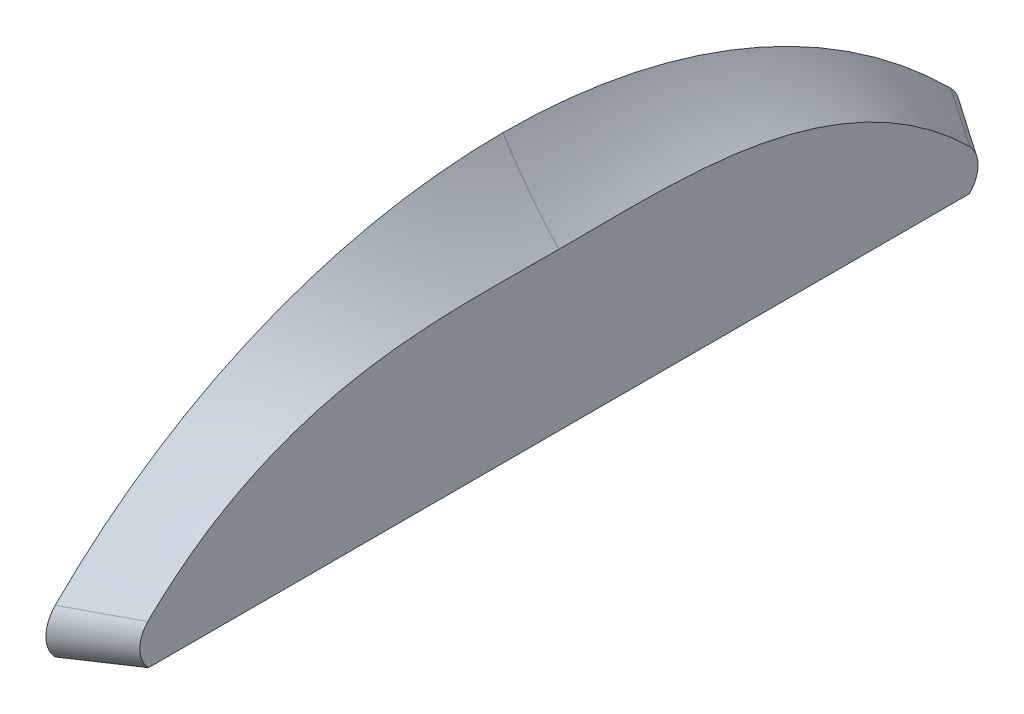
ISO-10303-21;
HEADER;
FILE_DESCRIPTION(('STEP AP214'),'2;1');
FILE_NAME('part.step','',(''),(''),'','','');
FILE_SCHEMA(('AUTOMOTIVE_DESIGN { 1 0 10303 214 1 1 1 1 }'));
ENDSEC;
DATA;
#1=APPLICATION_CONTEXT('core data for automotive mechanical design processes');
#2=APPLICATION_PROTOCOL_DEFINITION('international standard','automotive_design',2000,#1);
#3=PRODUCT_CONTEXT('',#1,'mechanical');
#4=PRODUCT('Part','Part','',(#3));
#5=PRODUCT_RELATED_PRODUCT_CATEGORY('part','',(#4));
#6=PRODUCT_DEFINITION_FORMATION('','',#4);
#7=PRODUCT_DEFINITION_CONTEXT('part definition',#1,'design');
#8=PRODUCT_DEFINITION('design','',#6,#7);
#9=PRODUCT_DEFINITION_SHAPE('','',#8);
#10=(LENGTH_UNIT() NAMED_UNIT(*) SI_UNIT(.MILLI.,.METRE.));
#11=(NAMED_UNIT(*) PLANE_ANGLE_UNIT() SI_UNIT($,.RADIAN.));
#12=(NAMED_UNIT(*) SI_UNIT($,.STERADIAN.) SOLID_ANGLE_UNIT());
#13=UNCERTAINTY_MEASURE_WITH_UNIT(LENGTH_MEASURE(1.E-05),#10,'distance_accuracy_value','');
#14=(GEOMETRIC_REPRESENTATION_CONTEXT(3) GLOBAL_UNCERTAINTY_ASSIGNED_CONTEXT((#13)) GLOBAL_UNIT_ASSIGNED_CONTEXT((#10,
#11,#12)) REPRESENTATION_CONTEXT('',''));
#15=CARTESIAN_POINT('',(0.,0.,0.));
#16=DIRECTION('',(0.,0.,1.));
#17=DIRECTION('',(1.,0.,0.));
#18=AXIS2_PLACEMENT_3D('',#15,#16,#17);
#19=CARTESIAN_POINT('',(0.,2.,-2.));
#20=DIRECTION('',(-1.,0.,0.));
#21=DIRECTION('',(0.,0.,1.));
#22=AXIS2_PLACEMENT_3D('',#19,#20,#21);
#23=PLANE('',#22);
#24=CARTESIAN_POINT('',(0.,4.99999999999999,-40.));
#25=DIRECTION('',(-1.,0.,0.));
#26=DIRECTION('',(0.,0.,1.));
#27=AXIS2_PLACEMENT_3D('',#24,#25,#26);
#28=CIRCLE('',#27,4.);
#29=CARTESIAN_POINT('',(0.,4.99999999999999,-36.));
#30=VERTEX_POINT('',#29);
#31=EDGE_CURVE('E217',#30,#30,#28,.T.);
#32=ORIENTED_EDGE('',*,*,#31,.F.);
#33=EDGE_LOOP('',(#32));
#34=FACE_BOUND('',#33,.T.);
#35=CARTESIAN_POINT('',(0.,2.,-2.));
#36=DIRECTION('',(1.,0.,0.));
#37=DIRECTION('',(0.,0.,1.));
#38=AXIS2_PLACEMENT_3D('',#35,#36,#37);
#39=CIRCLE('',#38,2.82842712474619);
#40=CARTESIAN_POINT('',(0.,4.,0.));
#41=VERTEX_POINT('',#40);
#42=CARTESIAN_POINT('',(0.,0.,0.));
#43=VERTEX_POINT('',#42);
#44=EDGE_CURVE('E345',#41,#43,#39,.T.);
#45=ORIENTED_EDGE('',*,*,#44,.F.);
#46=CARTESIAN_POINT('',(0.,-36.0000000000002,-40.));
#47=DIRECTION('',(1.,0.,0.));
#48=DIRECTION('',(0.,0.,1.));
#49=AXIS2_PLACEMENT_3D('',#46,#47,#48);
#50=CIRCLE('',#49,56.5685424949239);
#51=CARTESIAN_POINT('',(0.,20.5685424949238,-40.));
#52=VERTEX_POINT('',#51);
#53=EDGE_CURVE('E199',#52,#41,#50,.T.);
#54=ORIENTED_EDGE('',*,*,#53,.F.);
#55=CARTESIAN_POINT('',(0.,3.99999999999999,-80.));
#56=VERTEX_POINT('',#55);
#57=EDGE_CURVE('E344',#56,#52,#50,.T.);
#58=ORIENTED_EDGE('',*,*,#57,.F.);
#59=CARTESIAN_POINT('',(0.,2.,-78.));
#60=DIRECTION('',(1.,0.,0.));
#61=DIRECTION('',(0.,0.,-1.));
#62=AXIS2_PLACEMENT_3D('',#59,#60,#61);
#63=CIRCLE('',#62,2.8284271247462);
#64=CARTESIAN_POINT('',(0.,0.,-80.));
#65=VERTEX_POINT('',#64);
#66=EDGE_CURVE('E300',#65,#56,#63,.T.);
#67=ORIENTED_EDGE('',*,*,#66,.F.);
#68=DIRECTION('',(0.,0.,-1.));
#69=VECTOR('',#68,1.);
#70=CARTESIAN_POINT('',(0.,0.,0.));
#71=LINE('',#70,#69);
#72=EDGE_CURVE('E205',#43,#65,#71,.T.);
#73=ORIENTED_EDGE('',*,*,#72,.F.);
#74=EDGE_LOOP('',(#45,#54,#58,#67,#73));
#75=FACE_BOUND('',#74,.T.);
#76=ADVANCED_FACE('F140',(#34,#75),#23,.T.);
#77=CARTESIAN_POINT('',(0.,3.99999999999999,-80.));
#78=CARTESIAN_POINT('',(16.6666666666667,2.66666666666666,-69.0847300683473));
#79=CARTESIAN_POINT('',(33.3333333333333,1.33333333333333,-58.1694601366945));
#80=CARTESIAN_POINT('',(50.,0.,-47.2541902050417));
#81=CARTESIAN_POINT('',(0.,6.63904405261519,-77.3609559473848));
#82=CARTESIAN_POINT('',(16.6666666666667,4.57394141092913,-67.1632839463743));
#83=CARTESIAN_POINT('',(33.3333333333333,2.50883876924307,-56.9656119453637));
#84=CARTESIAN_POINT('',(50.,0.443736127557011,-46.7679399443531));
#85=CARTESIAN_POINT('',(0.,11.3720944633804,-71.5812116978277));
#86=CARTESIAN_POINT('',(15.950170355026,6.51788597364558,-62.9574696470849));
#87=CARTESIAN_POINT('',(32.629103556807,3.88093649349558,-54.3337275963421));
#88=CARTESIAN_POINT('',(50.,1.245103807066,-45.7099855455994));
#89=CARTESIAN_POINT('',(0.,16.6162347407487,-61.7420127961851));
#90=CARTESIAN_POINT('',(13.8006814201041,5.87642750944805,-55.8014690698099));
#91=CARTESIAN_POINT('',(30.5164142272278,4.00565631648663,-49.8609253434348));
#92=CARTESIAN_POINT('',(50.,2.13935229840692,-43.9203816170601));
#93=CARTESIAN_POINT('',(0.,19.8401866065488,-51.0920119199332));
#94=CARTESIAN_POINT('',(11.6511924851822,3.7734502946322,-48.058931934915));
#95=CARTESIAN_POINT('',(28.4037248976486,3.22752704980928,-45.0258519498969));
#96=CARTESIAN_POINT('',(50.,2.68942136102937,-41.9927719648795));
#97=CARTESIAN_POINT('',(0.,20.5685424949238,-43.7023061077576));
#98=CARTESIAN_POINT('',(10.9346961735416,2.8215150380922,-42.6893373185495));
#99=CARTESIAN_POINT('',(27.6994951211223,2.81257236123952,-41.6763685293058));
#100=CARTESIAN_POINT('',(50.,2.8125767374507,-40.6633997403421));
#101=CARTESIAN_POINT('',(0.,20.5685424949238,-40.));
#102=CARTESIAN_POINT('',(10.9346961735416,2.82153606086535,-40.));
#103=CARTESIAN_POINT('',(27.6994951211223,2.81260170348539,-40.));
#104=CARTESIAN_POINT('',(50.,2.81260169586887,-40.0000000000008));
#105=B_SPLINE_SURFACE_WITH_KNOTS('',3,3,((#77,#78,#79,#80),(#81,#82,#83,#84),(#85,#86,#87,#88),
(#89,#90,#91,#92),(#93,#94,#95,#96),(#97,#98,#99,#100),(#101,#102,#103,#104)),.UNSPECIFIED.,.F.,
.F.,.F.,(4,1,1,1,4),(4,4),(0.744223091094177,0.808167318320632,0.872111545547088,
0.936055772773544,1.),(0.,1.),.UNSPECIFIED.);
#106=CARTESIAN_POINT('',(5.,3.59999999999999,-76.7254190205042));
#107=CARTESIAN_POINT('',(5.,3.93743228357616,-76.3874018561561));
#108=CARTESIAN_POINT('',(5.,4.26765023761743,-76.0421847193579));
#109=CARTESIAN_POINT('',(5.,4.91305336804679,-75.3380492013204));
#110=CARTESIAN_POINT('',(5.,5.22824034681512,-74.9791324721533));
#111=CARTESIAN_POINT('',(5.,5.84303741353757,-74.2482403196132));
#112=CARTESIAN_POINT('',(5.,6.14264858405348,-73.8762658068108));
#113=CARTESIAN_POINT('',(5.,6.7257829860108,-73.1199272854748));
#114=CARTESIAN_POINT('',(5.,7.00930660717979,-72.7355635774285));
#115=CARTESIAN_POINT('',(5.,7.55501458514436,-71.9619058359314));
#116=CARTESIAN_POINT('',(5.,7.81748343604167,-71.5728124190995));
#117=CARTESIAN_POINT('',(5.,8.32599247402661,-70.7840431241096));
#118=CARTESIAN_POINT('',(5.,8.57203291478204,-70.384367409484));
#119=CARTESIAN_POINT('',(5.,9.0473155388448,-69.575165888886));
#120=CARTESIAN_POINT('',(5.,9.27655818285029,-69.1656403534653));
#121=CARTESIAN_POINT('',(5.,9.7179358459217,-68.3375077942191));
#122=CARTESIAN_POINT('',(5.,9.93007196262451,-67.9189013552585));
#123=CARTESIAN_POINT('',(5.,10.3373422104496,-67.0728350064427));
#124=CARTESIAN_POINT('',(5.,10.5324540206845,-66.6453643565745));
#125=CARTESIAN_POINT('',(5.,10.9052984125998,-65.7829008197929));
#126=CARTESIAN_POINT('',(5.,11.0830305296047,-65.3479077321202));
#127=CARTESIAN_POINT('',(5.,11.4211557563464,-64.4712051567223));
#128=CARTESIAN_POINT('',(5.,11.5815476779937,-64.0294952111435));
#129=CARTESIAN_POINT('',(5.,11.8851368938041,-63.1402056710114));
#130=CARTESIAN_POINT('',(5.,12.0283339677281,-62.6926260013574));
#131=CARTESIAN_POINT('',(5.,12.2990221749549,-61.7883957563251));
#132=CARTESIAN_POINT('',(5.,12.4263617772562,-61.331699878374));
#133=CARTESIAN_POINT('',(5.,12.6642653606371,-60.4139905299096));
#134=CARTESIAN_POINT('',(5.,12.7748300989486,-59.9529772552854));
#135=CARTESIAN_POINT('',(5.,12.979772806041,-59.027431837586));
#136=CARTESIAN_POINT('',(5.,13.0741526428364,-58.5629001070715));
#137=CARTESIAN_POINT('',(5.,13.2475078904096,-57.6311638525804));
#138=CARTESIAN_POINT('',(5.,13.3264890258607,-57.1639603886011));
#139=CARTESIAN_POINT('',(5.,13.4834911977533,-56.1395599554604));
#140=CARTESIAN_POINT('',(5.,13.5585569415281,-55.5819104072356));
#141=CARTESIAN_POINT('',(5.,13.6902095100587,-54.4644382967973));
#142=CARTESIAN_POINT('',(5.,13.7467955399675,-53.9046156421621));
#143=CARTESIAN_POINT('',(5.,13.8436291600977,-52.7832396184939));
#144=CARTESIAN_POINT('',(5.,13.8838668706888,-52.2216854089481));
#145=CARTESIAN_POINT('',(5.,13.9503294054591,-51.0973089222936));
#146=CARTESIAN_POINT('',(5.,13.9765427549874,-50.5344859840233));
#147=CARTESIAN_POINT('',(5.,14.017455103225,-49.4080448908364));
#148=CARTESIAN_POINT('',(5.,14.0321460205014,-48.8444264550463));
#149=CARTESIAN_POINT('',(5.,14.052549816619,-47.7275563872463));
#150=CARTESIAN_POINT('',(5.,14.0584250202647,-47.1743074462124));
#151=CARTESIAN_POINT('',(5.,14.0643881773846,-46.0679660488893));
#152=CARTESIAN_POINT('',(5.,14.0644779979006,-45.514873599719));
#153=CARTESIAN_POINT('',(5.,14.0615319358146,-44.4092862800449));
#154=CARTESIAN_POINT('',(5.,14.0584993546539,-43.856791395417));
#155=CARTESIAN_POINT('',(5.,14.0518660343467,-42.7528399211496));
#156=CARTESIAN_POINT('',(5.,14.048266369452,-42.2013833240343));
#157=CARTESIAN_POINT('',(5.,14.0441755921167,-41.3749374732235));
#158=CARTESIAN_POINT('',(5.,14.0430307910705,-41.0999519509151));
#159=CARTESIAN_POINT('',(5.,14.0414238818554,-40.549977837875));
#160=CARTESIAN_POINT('',(5.00000000000001,14.0409617766091,-40.2749892471352));
#161=CARTESIAN_POINT('',(5.00000000000003,14.0409660441617,-40.));
#162=B_SPLINE_CURVE_WITH_KNOTS('',3,(#106,#107,#108,#109,#110,#111,#112,#113,#114,#115,#116,
#117,#118,#119,#120,#121,#122,#123,#124,#125,#126,#127,#128,#129,#130,#131,#132,#133,#134,#135,
#136,#137,#138,#139,#140,#141,#142,#143,#144,#145,#146,#147,#148,#149,#150,#151,#152,#153,#154,
#155,#156,#157,#158,#159,#160,#161),.UNSPECIFIED.,.F.,.F.,(4,2,2,2,2,2,2,2,2,2,2,2,2,2,2,2,2,2,
2,2,2,2,2,2,2,2,2,4),(0.,1.43273489925903,2.86529756353206,4.29776052725402,5.73018877413619,
7.13781356403322,8.54541661404931,9.95298104453301,11.3604550869443,12.769747602725,
14.179077788027,15.5885044745873,16.9979492117726,18.4199693092654,19.8419251964366,
21.2637168549556,22.6849789312863,24.3726622680029,26.0604181855732,27.749192537579,
29.4393465300067,31.130684880218,32.7904809299915,34.449741332609,36.1072491321412,
37.761653983198,38.586616898807,39.411583345995),.UNSPECIFIED.);
#163=CARTESIAN_POINT('',(5.,3.59999999999999,-76.7254190205042));
#164=VERTEX_POINT('',#163);
#165=CARTESIAN_POINT('',(4.99999999782251,14.0409660464247,-40.));
#166=VERTEX_POINT('',#165);
#167=EDGE_CURVE('E161',#164,#166,#162,.T.);
#168=CARTESIAN_POINT('',(0.,3.99999999999999,-80.));
#169=CARTESIAN_POINT('',(16.6666666666667,2.66666666666666,-69.0847300683473));
#170=CARTESIAN_POINT('',(33.3333333333333,1.33333333333333,-58.1694601366945));
#171=CARTESIAN_POINT('',(50.,0.,-47.2541902050417));
#172=B_SPLINE_CURVE_WITH_KNOTS('',3,(#168,#169,#170,#171),.UNSPECIFIED.,.F.,.F.,(4,4),(0.,1.),.UNSPECIFIED.);
#173=EDGE_CURVE('E352',#56,#164,#172,.T.);
#174=CARTESIAN_POINT('',(0.,20.5685424949238,-40.));
#175=CARTESIAN_POINT('',(10.9346961735416,2.82153606086535,-40.));
#176=CARTESIAN_POINT('',(27.6994951211223,2.81260170348539,-40.));
#177=CARTESIAN_POINT('',(50.,2.81260169586887,-40.0000000000008));
#178=B_SPLINE_CURVE_WITH_KNOTS('',3,(#174,#175,#176,#177),.UNSPECIFIED.,.F.,.F.,(4,4),(0.,1.),.UNSPECIFIED.);
#179=EDGE_CURVE('E154',#52,#166,#178,.T.);
#180=ORIENTED_EDGE('',*,*,#167,.F.);
#181=ORIENTED_EDGE('',*,*,#173,.F.);
#182=ORIENTED_EDGE('',*,*,#57,.T.);
#183=ORIENTED_EDGE('',*,*,#179,.T.);
#184=EDGE_LOOP('',(#180,#181,#182,#183));
#185=FACE_BOUND('',#184,.T.);
#186=ADVANCED_FACE('F232',(#185),#105,.T.);
#187=CARTESIAN_POINT('',(0.,0.,-80.));
#188=CARTESIAN_POINT('',(16.6666666666667,0.,-68.8649061227399));
#189=CARTESIAN_POINT('',(33.3333333333333,0.,-57.7298122454798));
#190=CARTESIAN_POINT('',(50.,0.,-46.5947183682197));
#191=CARTESIAN_POINT('',(0.,0.261799386095722,-80.2617993860957));
#192=CARTESIAN_POINT('',(16.6666666666667,0.174532924063815,-69.0577577089377));
#193=CARTESIAN_POINT('',(33.3333333333333,0.0872664620319073,-57.8537160317796));
#194=CARTESIAN_POINT('',(50.,0.,-46.6496743546216));
#195=CARTESIAN_POINT('',(0.,0.889345576944907,-80.681300868557));
#196=CARTESIAN_POINT('',(16.6666666666667,0.592897051296605,-69.3740626881798));
#197=CARTESIAN_POINT('',(33.3333333333334,0.296448525648302,-58.0668245078025));
#198=CARTESIAN_POINT('',(50.0000000000001,0.,-46.7595863274253));
#199=CARTESIAN_POINT('',(0.,2.,-80.9021203978851));
#200=CARTESIAN_POINT('',(16.6666666666667,1.33333333333334,-69.5762316941336));
#201=CARTESIAN_POINT('',(33.3333333333333,0.666666666666668,-58.2503429903822));
#202=CARTESIAN_POINT('',(50.,0.,-46.9244542866307));
#203=CARTESIAN_POINT('',(0.,3.1106544230551,-80.6813008685571));
#204=CARTESIAN_POINT('',(16.6666666666667,2.07376961537007,-69.4839746609834));
#205=CARTESIAN_POINT('',(33.3333333333334,1.03688480768503,-58.2866484534099));
#206=CARTESIAN_POINT('',(50.0000000000001,0.,-47.0893222458363));
#207=CARTESIAN_POINT('',(0.,3.73820061390428,-80.2617993860957));
#208=CARTESIAN_POINT('',(16.6666666666667,2.49213374260285,-69.2409443302771));
#209=CARTESIAN_POINT('',(33.3333333333333,1.24606687130143,-58.2200892744585));
#210=CARTESIAN_POINT('',(50.,0.,-47.1992342186399));
#211=CARTESIAN_POINT('',(0.,3.99999999999999,-80.));
#212=CARTESIAN_POINT('',(16.6666666666667,2.66666666666666,-69.0847300683473));
#213=CARTESIAN_POINT('',(33.3333333333333,1.33333333333333,-58.1694601366945));
#214=CARTESIAN_POINT('',(50.,0.,-47.2541902050417));
#215=B_SPLINE_SURFACE_WITH_KNOTS('',3,3,((#187,#188,#189,#190),(#191,#192,#193,#194),(#195,#196,
#197,#198),(#199,#200,#201,#202),(#203,#204,#205,#206),(#207,#208,#209,#210),(#211,#212,#213,
#214)),.UNSPECIFIED.,.F.,.F.,.F.,(4,1,1,1,4),(4,4),(0.72088961147396,0.726722981379014,
0.732556351284068,0.738389721189122,0.744223091094177),(0.,1.),.UNSPECIFIED.);
#216=CARTESIAN_POINT('',(5.,0.,-76.659471836822));
#217=CARTESIAN_POINT('',(5.,0.0511488168467018,-76.7118126949849));
#218=CARTESIAN_POINT('',(5.,0.10452466581077,-76.7619709941109));
#219=CARTESIAN_POINT('',(5.,0.215314804936702,-76.8576199049824));
#220=CARTESIAN_POINT('',(5.,0.272729423525625,-76.9031101363859));
#221=CARTESIAN_POINT('',(5.,0.391146477501311,-76.9890924523508));
#222=CARTESIAN_POINT('',(5.,0.452147293723972,-77.0295867673589));
#223=CARTESIAN_POINT('',(5.,0.577341762314448,-77.1052971840566));
#224=CARTESIAN_POINT('',(5.,0.641535361954586,-77.1405133728741));
#225=CARTESIAN_POINT('',(5.,0.772666053999531,-77.2053169724821));
#226=CARTESIAN_POINT('',(5.,0.839601750755324,-77.2349072045036));
#227=CARTESIAN_POINT('',(5.,0.97575401334259,-77.2882236835449));
#228=CARTESIAN_POINT('',(5.,1.04497016593395,-77.3119509864309));
#229=CARTESIAN_POINT('',(5.,1.185115336312,-77.3534309711804));
#230=CARTESIAN_POINT('',(5.,1.25604309645116,-77.3711879047799));
#231=CARTESIAN_POINT('',(5.,1.39921583880213,-77.4006343950045));
#232=CARTESIAN_POINT('',(5.,1.47146200068962,-77.4123182111698));
#233=CARTESIAN_POINT('',(5.,1.61581215271314,-77.4293634913821));
#234=CARTESIAN_POINT('',(5.,1.68790713297469,-77.4348003165059));
#235=CARTESIAN_POINT('',(5.,1.83230335185098,-77.4394669144797));
#236=CARTESIAN_POINT('',(5.,1.90460466685098,-77.4386939730176));
#237=CARTESIAN_POINT('',(5.,2.12099597497724,-77.4271026830581));
#238=CARTESIAN_POINT('',(5.,2.26474244761141,-77.4070316597572));
#239=CARTESIAN_POINT('',(5.,2.4753066605448,-77.359115334133));
#240=CARTESIAN_POINT('',(5.,2.5443356053733,-77.3403059657367));
#241=CARTESIAN_POINT('',(5.,2.68048132502429,-77.2968954955494));
#242=CARTESIAN_POINT('',(5.,2.74759985544425,-77.2722999172473));
#243=CARTESIAN_POINT('',(5.,2.94535098790418,-77.1899719720296));
#244=CARTESIAN_POINT('',(5.,3.07255353093709,-77.1236588626164));
#245=CARTESIAN_POINT('',(5.,3.26633227779034,-77.0007179054517));
#246=CARTESIAN_POINT('',(5.,3.33710273869416,-76.9505101938476));
#247=CARTESIAN_POINT('',(5.,3.47295335784409,-76.84310361131));
#248=CARTESIAN_POINT('',(5.,3.53804165900599,-76.7859150361764));
#249=CARTESIAN_POINT('',(5.,3.59999999999999,-76.7254190205042));
#250=B_SPLINE_CURVE_WITH_KNOTS('',3,(#216,#217,#218,#219,#220,#221,#222,#223,#224,#225,#226,
#227,#228,#229,#230,#231,#232,#233,#234,#235,#236,#237,#238,#239,#240,#241,#242,#243,#244,#245,
#246,#247,#248,#249),.UNSPECIFIED.,.F.,.F.,(4,2,2,2,2,2,2,2,2,2,2,2,2,2,2,2,4),(0.,
0.219477114664113,0.438972097576259,0.658368728712478,0.877761737794023,1.09704443667954,
1.31628761568893,1.53537433062462,1.7546677568382,1.97128698737865,2.18800090814341,
2.62092424760503,2.8353554661266,3.04958281430292,3.47750799326977,3.73741546458134,
3.99694413791897),.UNSPECIFIED.);
#251=CARTESIAN_POINT('',(5.,0.,-76.659471836822));
#252=VERTEX_POINT('',#251);
#253=EDGE_CURVE('E168',#252,#164,#250,.T.);
#254=CARTESIAN_POINT('',(0.,0.,-80.));
#255=CARTESIAN_POINT('',(16.6666666666667,0.,-68.8649061227399));
#256=CARTESIAN_POINT('',(33.3333333333333,0.,-57.7298122454798));
#257=CARTESIAN_POINT('',(50.,0.,-46.5947183682197));
#258=B_SPLINE_CURVE_WITH_KNOTS('',3,(#254,#255,#256,#257),.UNSPECIFIED.,.F.,.F.,(4,4),(0.,1.),.UNSPECIFIED.);
#259=EDGE_CURVE('E353',#65,#252,#258,.T.);
#260=ORIENTED_EDGE('',*,*,#253,.F.);
#261=ORIENTED_EDGE('',*,*,#259,.F.);
#262=ORIENTED_EDGE('',*,*,#66,.T.);
#263=ORIENTED_EDGE('',*,*,#173,.T.);
#264=EDGE_LOOP('',(#260,#261,#262,#263));
#265=FACE_BOUND('',#264,.T.);
#266=ADVANCED_FACE('F256',(#265),#215,.T.);
#267=CARTESIAN_POINT('',(0.,0.,0.));
#268=DIRECTION('',(0.,-1.,0.));
#269=DIRECTION('',(0.,0.,-1.));
#270=AXIS2_PLACEMENT_3D('',#267,#268,#269);
#271=PLANE('',#270);
#272=DIRECTION('',(0.,0.,-1.));
#273=VECTOR('',#272,1.);
#274=CARTESIAN_POINT('',(5.,0.,0.));
#275=LINE('',#274,#273);
#276=CARTESIAN_POINT('',(5.,0.,-3.34045454545454));
#277=VERTEX_POINT('',#276);
#278=EDGE_CURVE('E214',#277,#252,#275,.T.);
#279=ORIENTED_EDGE('',*,*,#278,.F.);
#280=CARTESIAN_POINT('',(0.,0.,0.));
#281=CARTESIAN_POINT('',(16.6666666666667,0.,-11.1348484848485));
#282=CARTESIAN_POINT('',(33.3333333333333,0.,-22.269696969697));
#283=CARTESIAN_POINT('',(50.,0.,-33.4045454545455));
#284=B_SPLINE_CURVE_WITH_KNOTS('',3,(#280,#281,#282,#283),.UNSPECIFIED.,.F.,.F.,(4,4),(0.,1.),.UNSPECIFIED.);
#285=EDGE_CURVE('E204',#43,#277,#284,.T.);
#286=ORIENTED_EDGE('',*,*,#285,.F.);
#287=ORIENTED_EDGE('',*,*,#72,.T.);
#288=ORIENTED_EDGE('',*,*,#259,.T.);
#289=EDGE_LOOP('',(#279,#286,#287,#288));
#290=FACE_BOUND('',#289,.T.);
#291=ADVANCED_FACE('F142',(#290),#271,.T.);
#292=CARTESIAN_POINT('',(0.,4.,0.));
#293=CARTESIAN_POINT('',(16.6666666666667,2.66666666666667,-10.915));
#294=CARTESIAN_POINT('',(33.3333333333333,1.33333333333333,-21.83));
#295=CARTESIAN_POINT('',(50.,0.,-32.745));
#296=CARTESIAN_POINT('',(0.,3.73820061390428,0.261799386095719));
#297=CARTESIAN_POINT('',(16.6666666666667,2.49213374260285,-10.7587877830069));
#298=CARTESIAN_POINT('',(33.3333333333333,1.24606687130143,-21.7793749521095));
#299=CARTESIAN_POINT('',(50.,0.,-32.7999621212121));
#300=CARTESIAN_POINT('',(0.,3.11065442305509,0.681300868557217));
#301=CARTESIAN_POINT('',(16.6666666666667,2.07376961537006,-10.515761542174));
#302=CARTESIAN_POINT('',(33.3333333333333,1.03688480768503,-21.7128239529052));
#303=CARTESIAN_POINT('',(50.,0.,-32.9098863636364));
#304=CARTESIAN_POINT('',(0.,2.00000000000001,0.902120397884772));
#305=CARTESIAN_POINT('',(16.6666666666667,1.33333333333334,-10.4235106438344));
#306=CARTESIAN_POINT('',(33.3333333333334,0.666666666666669,-21.7491416855535));
#307=CARTESIAN_POINT('',(50.0000000000001,0.,-33.0747727272727));
#308=CARTESIAN_POINT('',(0.,0.889345576944917,0.681300868557222));
#309=CARTESIAN_POINT('',(16.6666666666667,0.592897051296611,-10.6256857845982));
#310=CARTESIAN_POINT('',(33.3333333333333,0.296448525648306,-21.9326724377537));
#311=CARTESIAN_POINT('',(50.,0.,-33.2396590909091));
#312=CARTESIAN_POINT('',(0.,0.261799386095723,0.261799386095723));
#313=CARTESIAN_POINT('',(16.6666666666667,0.174532924063816,-10.941994853714));
#314=CARTESIAN_POINT('',(33.3333333333333,0.0872664620319078,-22.1457890935236));
#315=CARTESIAN_POINT('',(50.,0.,-33.3495833333333));
#316=CARTESIAN_POINT('',(0.,0.,0.));
#317=CARTESIAN_POINT('',(16.6666666666667,0.,-11.1348484848485));
#318=CARTESIAN_POINT('',(33.3333333333333,0.,-22.269696969697));
#319=CARTESIAN_POINT('',(50.,0.,-33.4045454545455));
#320=B_SPLINE_SURFACE_WITH_KNOTS('',3,3,((#292,#293,#294,#295),(#296,#297,#298,#299),(#300,#301,
#302,#303),(#304,#305,#306,#307),(#308,#309,#310,#311),(#312,#313,#314,#315),(#316,#317,#318,
#319)),.UNSPECIFIED.,.F.,.F.,.F.,(4,1,1,1,4),(4,4),(0.25579021424713,0.261623886546305,
0.26745755884548,0.273291231144654,0.279124903443829),(0.,1.),.UNSPECIFIED.);
#321=CARTESIAN_POINT('',(5.,3.6,-3.2745));
#322=CARTESIAN_POINT('',(5.,3.51749186203193,-3.1939012074687));
#323=CARTESIAN_POINT('',(5.,3.42928684829486,-3.11911367760644));
#324=CARTESIAN_POINT('',(5.,3.24341173908781,-2.9823289359893));
#325=CARTESIAN_POINT('',(5.,3.14573855731913,-2.92033591555066));
#326=CARTESIAN_POINT('',(5.,2.98252051916328,-2.83183808090266));
#327=CARTESIAN_POINT('',(5.,2.91932653754998,-2.80092926685083));
#328=CARTESIAN_POINT('',(5.,2.79054927996777,-2.74457067225097));
#329=CARTESIAN_POINT('',(5.,2.72496581345368,-2.71912132817809));
#330=CARTESIAN_POINT('',(5.,2.5253418491453,-2.6512001910213));
#331=CARTESIAN_POINT('',(5.,2.38834860088624,-2.61711250048871));
#332=CARTESIAN_POINT('',(5.,2.1100167076104,-2.57180403676965));
#333=CARTESIAN_POINT('',(5.,1.96865979692565,-2.56069816595792));
#334=CARTESIAN_POINT('',(5.,1.68599629544457,-2.56232668360057));
#335=CARTESIAN_POINT('',(5.,1.5446897038734,-2.57506068753158));
#336=CARTESIAN_POINT('',(5.,1.33508993046166,-2.61147414129443));
#337=CARTESIAN_POINT('',(5.,1.26520169558626,-2.62664263348465));
#338=CARTESIAN_POINT('',(5.,1.12690542280786,-2.662722845137));
#339=CARTESIAN_POINT('',(5.,1.05849734316841,-2.68363440243172));
#340=CARTESIAN_POINT('',(5.,0.923657181644717,-2.73109941523135));
#341=CARTESIAN_POINT('',(5.,0.857225314519525,-2.75765348138443));
#342=CARTESIAN_POINT('',(5.,0.726848735943094,-2.81623905497365));
#343=CARTESIAN_POINT('',(5.,0.662903878534444,-2.8482702403719));
#344=CARTESIAN_POINT('',(5.,0.489924831171504,-2.94407802836477));
#345=CARTESIAN_POINT('',(5.,0.383864468657998,-3.01337967707288));
#346=CARTESIAN_POINT('',(5.,0.23324220274403,-3.12815484096427));
#347=CARTESIAN_POINT('',(5.,0.184443511471317,-3.16821971400462));
#348=CARTESIAN_POINT('',(5.,0.0898862280673335,-3.25179465643971));
#349=CARTESIAN_POINT('',(5.,0.0441278272990227,-3.29530494231967));
#350=CARTESIAN_POINT('',(5.,0.,-3.34045454545454));
#351=B_SPLINE_CURVE_WITH_KNOTS('',3,(#321,#322,#323,#324,#325,#326,#327,#328,#329,#330,#331,
#332,#333,#334,#335,#336,#337,#338,#339,#340,#341,#342,#343,#344,#345,#346,#347,#348,#349,#350),
.UNSPECIFIED.,.F.,.F.,(4,2,2,2,2,2,2,2,2,2,2,2,2,2,4),(0.,0.345797022912793,0.69170714529531,
0.902517605346588,1.11334491305228,1.53473295791806,1.95822277893635,2.38170576936788,
2.59605383287214,2.81039584443476,3.02476106451672,3.23911368490883,3.6176288967695,
3.80690900639607,3.99620101848904),.UNSPECIFIED.);
#352=CARTESIAN_POINT('',(5.,3.6,-3.2745));
#353=VERTEX_POINT('',#352);
#354=EDGE_CURVE('E209',#353,#277,#351,.T.);
#355=CARTESIAN_POINT('',(0.,4.,0.));
#356=CARTESIAN_POINT('',(16.6666666666667,2.66666666666667,-10.915));
#357=CARTESIAN_POINT('',(33.3333333333333,1.33333333333333,-21.83));
#358=CARTESIAN_POINT('',(50.,0.,-32.745));
#359=B_SPLINE_CURVE_WITH_KNOTS('',3,(#355,#356,#357,#358),.UNSPECIFIED.,.F.,.F.,(4,4),(0.,1.),.UNSPECIFIED.);
#360=EDGE_CURVE('E194',#41,#353,#359,.T.);
#361=ORIENTED_EDGE('',*,*,#354,.F.);
#362=ORIENTED_EDGE('',*,*,#360,.F.);
#363=ORIENTED_EDGE('',*,*,#44,.T.);
#364=ORIENTED_EDGE('',*,*,#285,.T.);
#365=EDGE_LOOP('',(#361,#362,#363,#364));
#366=FACE_BOUND('',#365,.T.);
#367=ADVANCED_FACE('F210',(#366),#320,.T.);
#368=CARTESIAN_POINT('',(0.,20.5685424949238,-40.));
#369=CARTESIAN_POINT('',(10.9346961735416,2.82153606086535,-40.));
#370=CARTESIAN_POINT('',(27.6994951211223,2.81260170348539,-40.));
#371=CARTESIAN_POINT('',(50.,2.81260169586887,-40.0000000000008));
#372=CARTESIAN_POINT('',(0.,20.5685424949238,-36.29750130079));
#373=CARTESIAN_POINT('',(10.9346961735416,2.82155708473209,-37.3105227839474));
#374=CARTESIAN_POINT('',(27.6994951211223,2.81263104725763,-38.3235442671403));
#375=CARTESIAN_POINT('',(50.,2.81262665558536,-39.336565750055));
#376=CARTESIAN_POINT('',(0.,19.8401154170973,-28.9076076647471));
#377=CARTESIAN_POINT('',(11.6511924851822,3.77349912754999,-31.9407658074633));
#378=CARTESIAN_POINT('',(28.4037248976487,3.22764508925137,-34.9739239502745));
#379=CARTESIAN_POINT('',(50.,2.68955779115078,-38.0070820917047));
#380=CARTESIAN_POINT('',(0.,16.6161034559092,-18.2577004009495));
#381=CARTESIAN_POINT('',(13.8006814201041,5.87644148107349,-24.1982113167752));
#382=CARTESIAN_POINT('',(30.5164142272278,4.0057742567029,-30.1387222326782));
#383=CARTESIAN_POINT('',(50.,2.13953291933999,-36.0792331474589));
#384=CARTESIAN_POINT('',(0.,11.3720276768218,-8.41871476285649));
#385=CARTESIAN_POINT('',(15.950170355026,6.51789703159561,-17.04227102525));
#386=CARTESIAN_POINT('',(32.629103556807,3.88101269199295,-25.6658272876672));
#387=CARTESIAN_POINT('',(50.,1.24523244214948,-34.2893835497392));
#388=CARTESIAN_POINT('',(0.,6.63904409246962,-2.63904409246963));
#389=CARTESIAN_POINT('',(16.6666666666667,4.57395659823565,-12.836462761822));
#390=CARTESIAN_POINT('',(33.3333333333333,2.50886910400167,-23.0338814311744));
#391=CARTESIAN_POINT('',(50.,0.443781609767695,-33.2313001005268));
#392=CARTESIAN_POINT('',(0.,4.,0.));
#393=CARTESIAN_POINT('',(16.6666666666667,2.66666666666667,-10.915));
#394=CARTESIAN_POINT('',(33.3333333333333,1.33333333333333,-21.83));
#395=CARTESIAN_POINT('',(50.,0.,-32.745));
#396=B_SPLINE_SURFACE_WITH_KNOTS('',3,3,((#368,#369,#370,#371),(#372,#373,#374,#375),(#376,#377,
#378,#379),(#380,#381,#382,#383),(#384,#385,#386,#387),(#388,#389,#390,#391),(#392,#393,#394,
#395)),.UNSPECIFIED.,.F.,.F.,.F.,(4,1,1,1,4),(4,4),(0.,0.0639475535617826,0.127895107123565,
0.191842660685348,0.25579021424713),(0.,1.),.UNSPECIFIED.);
#397=CARTESIAN_POINT('',(4.99999999856672,14.0409660471408,-40.));
#398=CARTESIAN_POINT('',(4.99999999948511,14.0409441539015,-39.5758257928182));
#399=CARTESIAN_POINT('',(4.99999999986199,14.0420593836273,-39.1516551944734));
#400=CARTESIAN_POINT('',(5.00000000013811,14.0455829547407,-38.3030214777094));
#401=CARTESIAN_POINT('',(5.00000000003701,14.0479922021839,-37.8785583627024));
#402=CARTESIAN_POINT('',(4.99999999996297,14.0531212087982,-37.029426145117));
#403=CARTESIAN_POINT('',(4.99999999999008,14.0558411199163,-36.6047570437742));
#404=CARTESIAN_POINT('',(5.00000000000993,14.0604782807002,-35.755296130507));
#405=CARTESIAN_POINT('',(5.00000000000266,14.0623953080717,-35.3305043171412));
#406=CARTESIAN_POINT('',(4.99999999999734,14.0642596077262,-34.4808815271381));
#407=CARTESIAN_POINT('',(4.99999999999928,14.0642067266955,-34.056050550026));
#408=CARTESIAN_POINT('',(5.00000000000073,14.0608994378944,-33.1989375948005));
#409=CARTESIAN_POINT('',(5.0000000000002,14.0575888263589,-32.7666557782155));
#410=CARTESIAN_POINT('',(4.9999999999998,14.0464082703539,-31.9022260994095));
#411=CARTESIAN_POINT('',(4.99999999999995,14.0385391645738,-31.4700782271743));
#412=CARTESIAN_POINT('',(5.00000000000005,14.0169784825218,-30.6060059129998));
#413=CARTESIAN_POINT('',(5.00000000000001,14.0032880322319,-30.1740814440167));
#414=CARTESIAN_POINT('',(4.99999999999999,13.9688684465812,-29.3105433150413));
#415=CARTESIAN_POINT('',(5.,13.9481399200274,-28.8789296314005));
#416=CARTESIAN_POINT('',(5.,13.8985045821,-28.0161022452724));
#417=CARTESIAN_POINT('',(5.,13.8695965222287,-27.5848886139364));
#418=CARTESIAN_POINT('',(5.,13.7937219468961,-26.6101297731266));
#419=CARTESIAN_POINT('',(5.,13.7440074795407,-26.0667931965869));
#420=CARTESIAN_POINT('',(5.,13.6278152939436,-24.9818039962027));
#421=CARTESIAN_POINT('',(5.,13.5613347266627,-24.4401516744132));
#422=CARTESIAN_POINT('',(5.,13.409845123432,-23.3594525199217));
#423=CARTESIAN_POINT('',(5.,13.3248370623947,-22.8204055516516));
#424=CARTESIAN_POINT('',(5.,13.1347600759931,-21.7458097085166));
#425=CARTESIAN_POINT('',(5.,13.0296900552281,-21.2102610263133));
#426=CARTESIAN_POINT('',(5.,12.799409222632,-20.1492347711758));
#427=CARTESIAN_POINT('',(5.,12.6744156108137,-19.623710224059));
#428=CARTESIAN_POINT('',(5.,12.4026239950708,-18.5782456156235));
#429=CARTESIAN_POINT('',(5.,12.2558233168376,-18.0583062476408));
#430=CARTESIAN_POINT('',(5.,11.9398048616604,-17.0252988560667));
#431=CARTESIAN_POINT('',(5.,11.7705880358376,-16.5122305419515));
#432=CARTESIAN_POINT('',(5.,11.4093378086784,-15.4941728659362));
#433=CARTESIAN_POINT('',(5.,11.2173044821212,-14.989183477564));
#434=CARTESIAN_POINT('',(5.,10.8460713043083,-14.0765713661721));
#435=CARTESIAN_POINT('',(5.,10.6705554623278,-13.6674462619844));
#436=CARTESIAN_POINT('',(5.,10.303913668885,-12.8561855396402));
#437=CARTESIAN_POINT('',(5.,10.1127859126404,-12.4540507361181));
#438=CARTESIAN_POINT('',(5.,9.71502542780087,-11.6575038847497));
#439=CARTESIAN_POINT('',(5.,9.50839211967086,-11.263092126255));
#440=CARTESIAN_POINT('',(5.,9.07980994627717,-10.4826720012449));
#441=CARTESIAN_POINT('',(5.,8.85786092307269,-10.0966637214429));
#442=CARTESIAN_POINT('',(5.,8.39892595577074,-9.33368693090498));
#443=CARTESIAN_POINT('',(5.,8.1619398653725,-8.95671850817015));
#444=CARTESIAN_POINT('',(5.,7.66681183255086,-8.20262556393348));
#445=CARTESIAN_POINT('',(5.,7.40827682217232,-7.82575902203173));
#446=CARTESIAN_POINT('',(5.,6.87609606969416,-7.0828263144194));
#447=CARTESIAN_POINT('',(5.,6.60244967462634,-6.71676061646734));
#448=CARTESIAN_POINT('',(5.,6.04045642267068,-5.99601734069202));
#449=CARTESIAN_POINT('',(5.,5.75210769555495,-5.64134122109332));
#450=CARTESIAN_POINT('',(5.,5.16114317106239,-4.94394712378118));
#451=CARTESIAN_POINT('',(5.,4.85852425825254,-4.6012317860012));
#452=CARTESIAN_POINT('',(5.,4.23947695732176,-3.92830884864478));
#453=CARTESIAN_POINT('',(4.99999999999998,3.92304423479402,-3.5981052365122));
#454=CARTESIAN_POINT('',(4.99999999999996,3.60000000000001,-3.27449999999997));
#455=B_SPLINE_CURVE_WITH_KNOTS('',3,(#397,#398,#399,#400,#401,#402,#403,#404,#405,#406,#407,
#408,#409,#410,#411,#412,#413,#414,#415,#416,#417,#418,#419,#420,#421,#422,#423,#424,#425,#426,
#427,#428,#429,#430,#431,#432,#433,#434,#435,#436,#437,#438,#439,#440,#441,#442,#443,#444,#445,
#446,#447,#448,#449,#450,#451,#452,#453,#454),.UNSPECIFIED.,.F.,.F.,(4,2,2,2,2,2,2,2,2,2,2,2,2,
2,2,2,2,2,2,2,2,2,2,2,2,2,2,2,4),(0.,1.27251617283478,2.54592450997283,3.81995836539354,
5.09434472962129,6.36883027666969,7.66569629239758,8.96232378143317,10.2587005868843,
11.5549652818272,12.8514279412633,14.4880113948628,16.1248731383354,17.7616487712977,
19.3985137992198,21.0186216671867,22.6389283812679,24.2591663674388,25.8793990435633,
27.2146401669907,28.5500358671852,29.8854815039684,31.2209409143752,32.5564133199181,
33.9270994781211,35.2978449105675,36.6687651474862,38.0399860787829,39.4116403995615),.UNSPECIFIED.);
#456=EDGE_CURVE('E13',#166,#353,#455,.T.);
#457=ORIENTED_EDGE('',*,*,#456,.F.);
#458=ORIENTED_EDGE('',*,*,#179,.F.);
#459=ORIENTED_EDGE('',*,*,#53,.T.);
#460=ORIENTED_EDGE('',*,*,#360,.T.);
#461=EDGE_LOOP('',(#457,#458,#459,#460));
#462=FACE_BOUND('',#461,.T.);
#463=ADVANCED_FACE('F196',(#462),#396,.T.);
#464=CARTESIAN_POINT('',(-1.,4.99999999999999,-40.));
#465=DIRECTION('',(1.,0.,0.));
#466=DIRECTION('',(0.,0.,-1.));
#467=AXIS2_PLACEMENT_3D('',#464,#465,#466);
#468=CYLINDRICAL_SURFACE('',#467,4.);
#469=CARTESIAN_POINT('',(-1.,4.99999999999999,-40.));
#470=DIRECTION('',(-1.,0.,0.));
#471=DIRECTION('',(0.,0.,1.));
#472=AXIS2_PLACEMENT_3D('',#469,#470,#471);
#473=CIRCLE('',#472,4.);
#474=CARTESIAN_POINT('',(-1.,4.99999999999999,-36.));
#475=VERTEX_POINT('',#474);
#476=EDGE_CURVE('E220',#475,#475,#473,.T.);
#477=ORIENTED_EDGE('',*,*,#476,.F.);
#478=EDGE_LOOP('',(#477));
#479=FACE_BOUND('',#478,.T.);
#480=ORIENTED_EDGE('',*,*,#31,.T.);
#481=EDGE_LOOP('',(#480));
#482=FACE_BOUND('',#481,.T.);
#483=ADVANCED_FACE('F319',(#479,#482),#468,.T.);
#484=CARTESIAN_POINT('',(-1.,4.99999999999999,-40.));
#485=DIRECTION('',(-1.,0.,0.));
#486=DIRECTION('',(0.,0.,1.));
#487=AXIS2_PLACEMENT_3D('',#484,#485,#486);
#488=PLANE('',#487);
#489=ORIENTED_EDGE('',*,*,#476,.T.);
#490=EDGE_LOOP('',(#489));
#491=FACE_BOUND('',#490,.T.);
#492=ADVANCED_FACE('F239',(#491),#488,.T.);
#493=CARTESIAN_POINT('',(5.,0.,0.));
#494=DIRECTION('',(-1.,0.,0.));
#495=DIRECTION('',(0.,0.,1.));
#496=AXIS2_PLACEMENT_3D('',#493,#494,#495);
#497=PLANE('',#496);
#498=ORIENTED_EDGE('',*,*,#253,.T.);
#499=ORIENTED_EDGE('',*,*,#167,.T.);
#500=ORIENTED_EDGE('',*,*,#456,.T.);
#501=ORIENTED_EDGE('',*,*,#354,.T.);
#502=ORIENTED_EDGE('',*,*,#278,.T.);
#503=EDGE_LOOP('',(#498,#499,#500,#501,#502));
#504=FACE_BOUND('',#503,.T.);
#505=ADVANCED_FACE('F216',(#504),#497,.F.);
#506=CLOSED_SHELL('',(#76,#186,#266,#291,#367,#463,#483,#492,#505));
#507=MANIFOLD_SOLID_BREP('B2',#506);
#508=ADVANCED_BREP_SHAPE_REPRESENTATION('',(#18,#507),#14);
#509=SHAPE_DEFINITION_REPRESENTATION(#9,#508);
ENDSEC;
END-ISO-10303-21;
